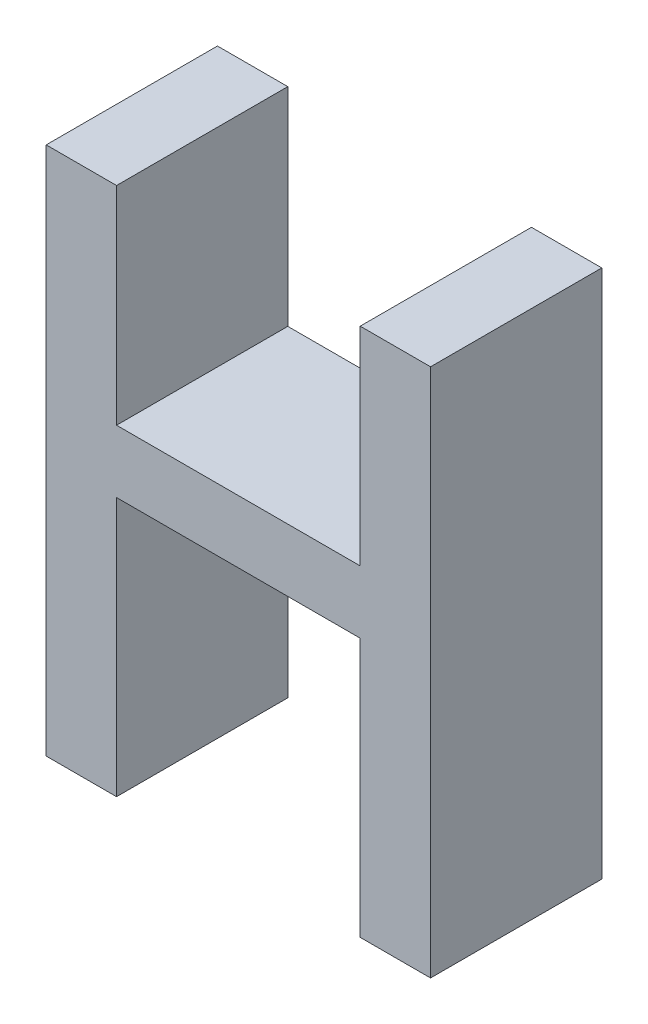
ISO-10303-21;
HEADER;
FILE_DESCRIPTION(('STEP AP214'),'2;1');
FILE_NAME('part.step','',(''),(''),'','','');
FILE_SCHEMA(('AUTOMOTIVE_DESIGN { 1 0 10303 214 1 1 1 1 }'));
ENDSEC;
DATA;
#1=APPLICATION_CONTEXT('core data for automotive mechanical design processes');
#2=APPLICATION_PROTOCOL_DEFINITION('international standard','automotive_design',2000,#1);
#3=PRODUCT_CONTEXT('',#1,'mechanical');
#4=PRODUCT('Part','Part','',(#3));
#5=PRODUCT_RELATED_PRODUCT_CATEGORY('part','',(#4));
#6=PRODUCT_DEFINITION_FORMATION('','',#4);
#7=PRODUCT_DEFINITION_CONTEXT('part definition',#1,'design');
#8=PRODUCT_DEFINITION('design','',#6,#7);
#9=PRODUCT_DEFINITION_SHAPE('','',#8);
#10=(LENGTH_UNIT() NAMED_UNIT(*) SI_UNIT(.MILLI.,.METRE.));
#11=(NAMED_UNIT(*) PLANE_ANGLE_UNIT() SI_UNIT($,.RADIAN.));
#12=(NAMED_UNIT(*) SI_UNIT($,.STERADIAN.) SOLID_ANGLE_UNIT());
#13=UNCERTAINTY_MEASURE_WITH_UNIT(LENGTH_MEASURE(1.E-05),#10,'distance_accuracy_value','');
#14=(GEOMETRIC_REPRESENTATION_CONTEXT(3) GLOBAL_UNCERTAINTY_ASSIGNED_CONTEXT((#13)) GLOBAL_UNIT_ASSIGNED_CONTEXT((#10,
#11,#12)) REPRESENTATION_CONTEXT('',''));
#15=CARTESIAN_POINT('',(0.,0.,0.));
#16=DIRECTION('',(0.,0.,1.));
#17=DIRECTION('',(1.,0.,0.));
#18=AXIS2_PLACEMENT_3D('',#15,#16,#17);
#19=CARTESIAN_POINT('',(-0.424212791142524,-2.790411377833,0.));
#20=DIRECTION('',(-1.,0.,0.));
#21=DIRECTION('',(0.,-1.,0.));
#22=AXIS2_PLACEMENT_3D('',#19,#20,#21);
#23=PLANE('',#22);
#24=DIRECTION('',(0.,1.,0.));
#25=VECTOR('',#24,1.);
#26=CARTESIAN_POINT('',(-0.424212791142524,-2.941706644287,0.));
#27=LINE('',#26,#25);
#28=CARTESIAN_POINT('',(-0.424212791142524,-2.941706644287,0.));
#29=VERTEX_POINT('',#28);
#30=CARTESIAN_POINT('',(-0.424212791142524,-2.790411377833,0.));
#31=VERTEX_POINT('',#30);
#32=EDGE_CURVE('E11',#29,#31,#27,.T.);
#33=ORIENTED_EDGE('',*,*,#32,.F.);
#34=DIRECTION('',(0.,0.,1.));
#35=VECTOR('',#34,1.);
#36=CARTESIAN_POINT('',(-0.424212791142524,-2.941706644287,0.));
#37=LINE('',#36,#35);
#38=CARTESIAN_POINT('',(-0.424212791142524,-2.941706644287,0.1));
#39=VERTEX_POINT('',#38);
#40=EDGE_CURVE('E24',#29,#39,#37,.T.);
#41=ORIENTED_EDGE('',*,*,#40,.T.);
#42=DIRECTION('',(0.,-1.,0.));
#43=VECTOR('',#42,1.);
#44=CARTESIAN_POINT('',(-0.424212791142524,-2.941706644287,0.1));
#45=LINE('',#44,#43);
#46=CARTESIAN_POINT('',(-0.424212791142524,-2.790411377833,0.1));
#47=VERTEX_POINT('',#46);
#48=EDGE_CURVE('E124',#47,#39,#45,.T.);
#49=ORIENTED_EDGE('',*,*,#48,.F.);
#50=DIRECTION('',(0.,0.,1.));
#51=VECTOR('',#50,1.);
#52=CARTESIAN_POINT('',(-0.424212791142524,-2.790411377833,0.));
#53=LINE('',#52,#51);
#54=EDGE_CURVE('E197',#31,#47,#53,.T.);
#55=ORIENTED_EDGE('',*,*,#54,.F.);
#56=EDGE_LOOP('',(#33,#41,#49,#55));
#57=FACE_BOUND('',#56,.T.);
#58=ADVANCED_FACE('F17',(#57),#23,.T.);
#59=CARTESIAN_POINT('',(-0.566490458933513,-2.790411377833,0.));
#60=DIRECTION('',(0.,-1.,0.));
#61=DIRECTION('',(1.,0.,0.));
#62=AXIS2_PLACEMENT_3D('',#59,#60,#61);
#63=PLANE('',#62);
#64=DIRECTION('',(-1.,0.,0.));
#65=VECTOR('',#64,1.);
#66=CARTESIAN_POINT('',(-0.424212791142524,-2.790411377833,0.));
#67=LINE('',#66,#65);
#68=CARTESIAN_POINT('',(-0.566490458933513,-2.790411377833,0.));
#69=VERTEX_POINT('',#68);
#70=EDGE_CURVE('E195',#31,#69,#67,.T.);
#71=ORIENTED_EDGE('',*,*,#70,.F.);
#72=ORIENTED_EDGE('',*,*,#54,.T.);
#73=DIRECTION('',(1.,0.,0.));
#74=VECTOR('',#73,1.);
#75=CARTESIAN_POINT('',(-0.424212791142524,-2.790411377833,0.1));
#76=LINE('',#75,#74);
#77=CARTESIAN_POINT('',(-0.566490458933513,-2.790411377833,0.1));
#78=VERTEX_POINT('',#77);
#79=EDGE_CURVE('E193',#78,#47,#76,.T.);
#80=ORIENTED_EDGE('',*,*,#79,.F.);
#81=DIRECTION('',(0.,0.,1.));
#82=VECTOR('',#81,1.);
#83=CARTESIAN_POINT('',(-0.566490458933513,-2.790411377833,0.));
#84=LINE('',#83,#82);
#85=EDGE_CURVE('E190',#69,#78,#84,.T.);
#86=ORIENTED_EDGE('',*,*,#85,.F.);
#87=EDGE_LOOP('',(#71,#72,#80,#86));
#88=FACE_BOUND('',#87,.T.);
#89=ADVANCED_FACE('F235',(#88),#63,.T.);
#90=CARTESIAN_POINT('',(-0.566490458933513,-2.941706644287,0.));
#91=DIRECTION('',(1.,0.,0.));
#92=DIRECTION('',(0.,1.,0.));
#93=AXIS2_PLACEMENT_3D('',#90,#91,#92);
#94=PLANE('',#93);
#95=DIRECTION('',(0.,-1.,0.));
#96=VECTOR('',#95,1.);
#97=CARTESIAN_POINT('',(-0.566490458933513,-2.790411377833,0.));
#98=LINE('',#97,#96);
#99=CARTESIAN_POINT('',(-0.566490458933513,-2.941706644287,0.));
#100=VERTEX_POINT('',#99);
#101=EDGE_CURVE('E188',#69,#100,#98,.T.);
#102=ORIENTED_EDGE('',*,*,#101,.F.);
#103=ORIENTED_EDGE('',*,*,#85,.T.);
#104=DIRECTION('',(0.,1.,0.));
#105=VECTOR('',#104,1.);
#106=CARTESIAN_POINT('',(-0.566490458933513,-2.790411377833,0.1));
#107=LINE('',#106,#105);
#108=CARTESIAN_POINT('',(-0.566490458933513,-2.941706644287,0.1));
#109=VERTEX_POINT('',#108);
#110=EDGE_CURVE('E185',#109,#78,#107,.T.);
#111=ORIENTED_EDGE('',*,*,#110,.F.);
#112=DIRECTION('',(0.,0.,1.));
#113=VECTOR('',#112,1.);
#114=CARTESIAN_POINT('',(-0.566490458933513,-2.941706644287,0.));
#115=LINE('',#114,#113);
#116=EDGE_CURVE('E182',#100,#109,#115,.T.);
#117=ORIENTED_EDGE('',*,*,#116,.F.);
#118=EDGE_LOOP('',(#102,#103,#111,#117));
#119=FACE_BOUND('',#118,.T.);
#120=ADVANCED_FACE('F231',(#119),#94,.T.);
#121=CARTESIAN_POINT('',(-0.607570630619644,-2.941706644287,0.));
#122=DIRECTION('',(0.,-1.,0.));
#123=DIRECTION('',(1.,0.,0.));
#124=AXIS2_PLACEMENT_3D('',#121,#122,#123);
#125=PLANE('',#124);
#126=DIRECTION('',(-1.,0.,0.));
#127=VECTOR('',#126,1.);
#128=CARTESIAN_POINT('',(-0.566490458933513,-2.941706644287,0.));
#129=LINE('',#128,#127);
#130=CARTESIAN_POINT('',(-0.607570630619644,-2.941706644287,0.));
#131=VERTEX_POINT('',#130);
#132=EDGE_CURVE('E180',#100,#131,#129,.T.);
#133=ORIENTED_EDGE('',*,*,#132,.F.);
#134=ORIENTED_EDGE('',*,*,#116,.T.);
#135=DIRECTION('',(1.,0.,0.));
#136=VECTOR('',#135,1.);
#137=CARTESIAN_POINT('',(-0.566490458933513,-2.941706644287,0.1));
#138=LINE('',#137,#136);
#139=CARTESIAN_POINT('',(-0.607570630619644,-2.941706644287,0.1));
#140=VERTEX_POINT('',#139);
#141=EDGE_CURVE('E177',#140,#109,#138,.T.);
#142=ORIENTED_EDGE('',*,*,#141,.F.);
#143=DIRECTION('',(0.,0.,1.));
#144=VECTOR('',#143,1.);
#145=CARTESIAN_POINT('',(-0.607570630619644,-2.941706644287,0.));
#146=LINE('',#145,#144);
#147=EDGE_CURVE('E174',#131,#140,#146,.T.);
#148=ORIENTED_EDGE('',*,*,#147,.F.);
#149=EDGE_LOOP('',(#133,#134,#142,#148));
#150=FACE_BOUND('',#149,.T.);
#151=ADVANCED_FACE('F227',(#150),#125,.T.);
#152=CARTESIAN_POINT('',(-0.607570630619644,-2.632603401234,0.));
#153=DIRECTION('',(-1.,0.,0.));
#154=DIRECTION('',(0.,-1.,0.));
#155=AXIS2_PLACEMENT_3D('',#152,#153,#154);
#156=PLANE('',#155);
#157=DIRECTION('',(0.,1.,0.));
#158=VECTOR('',#157,1.);
#159=CARTESIAN_POINT('',(-0.607570630619644,-2.941706644287,0.));
#160=LINE('',#159,#158);
#161=CARTESIAN_POINT('',(-0.607570630619644,-2.632603401234,0.));
#162=VERTEX_POINT('',#161);
#163=EDGE_CURVE('E172',#131,#162,#160,.T.);
#164=ORIENTED_EDGE('',*,*,#163,.F.);
#165=ORIENTED_EDGE('',*,*,#147,.T.);
#166=DIRECTION('',(0.,-1.,0.));
#167=VECTOR('',#166,1.);
#168=CARTESIAN_POINT('',(-0.607570630619644,-2.941706644287,0.1));
#169=LINE('',#168,#167);
#170=CARTESIAN_POINT('',(-0.607570630619644,-2.632603401234,0.1));
#171=VERTEX_POINT('',#170);
#172=EDGE_CURVE('E169',#171,#140,#169,.T.);
#173=ORIENTED_EDGE('',*,*,#172,.F.);
#174=DIRECTION('',(0.,0.,1.));
#175=VECTOR('',#174,1.);
#176=CARTESIAN_POINT('',(-0.607570630619644,-2.632603401234,0.));
#177=LINE('',#176,#175);
#178=EDGE_CURVE('E166',#162,#171,#177,.T.);
#179=ORIENTED_EDGE('',*,*,#178,.F.);
#180=EDGE_LOOP('',(#164,#165,#173,#179));
#181=FACE_BOUND('',#180,.T.);
#182=ADVANCED_FACE('F223',(#181),#156,.T.);
#183=CARTESIAN_POINT('',(-0.566490458933513,-2.632603401234,0.));
#184=DIRECTION('',(0.,1.,0.));
#185=DIRECTION('',(-1.,0.,0.));
#186=AXIS2_PLACEMENT_3D('',#183,#184,#185);
#187=PLANE('',#186);
#188=DIRECTION('',(1.,0.,0.));
#189=VECTOR('',#188,1.);
#190=CARTESIAN_POINT('',(-0.607570630619644,-2.632603401234,0.));
#191=LINE('',#190,#189);
#192=CARTESIAN_POINT('',(-0.566490458933513,-2.632603401234,0.));
#193=VERTEX_POINT('',#192);
#194=EDGE_CURVE('E164',#162,#193,#191,.T.);
#195=ORIENTED_EDGE('',*,*,#194,.F.);
#196=ORIENTED_EDGE('',*,*,#178,.T.);
#197=DIRECTION('',(-1.,0.,0.));
#198=VECTOR('',#197,1.);
#199=CARTESIAN_POINT('',(-0.607570630619644,-2.632603401234,0.1));
#200=LINE('',#199,#198);
#201=CARTESIAN_POINT('',(-0.566490458933513,-2.632603401234,0.1));
#202=VERTEX_POINT('',#201);
#203=EDGE_CURVE('E161',#202,#171,#200,.T.);
#204=ORIENTED_EDGE('',*,*,#203,.F.);
#205=DIRECTION('',(0.,0.,1.));
#206=VECTOR('',#205,1.);
#207=CARTESIAN_POINT('',(-0.566490458933513,-2.632603401234,0.));
#208=LINE('',#207,#206);
#209=EDGE_CURVE('E158',#193,#202,#208,.T.);
#210=ORIENTED_EDGE('',*,*,#209,.F.);
#211=EDGE_LOOP('',(#195,#196,#204,#210));
#212=FACE_BOUND('',#211,.T.);
#213=ADVANCED_FACE('F219',(#212),#187,.T.);
#214=CARTESIAN_POINT('',(-0.566490458933513,-2.753840005479,0.));
#215=DIRECTION('',(1.,0.,0.));
#216=DIRECTION('',(0.,1.,0.));
#217=AXIS2_PLACEMENT_3D('',#214,#215,#216);
#218=PLANE('',#217);
#219=DIRECTION('',(0.,-1.,0.));
#220=VECTOR('',#219,1.);
#221=CARTESIAN_POINT('',(-0.566490458933513,-2.632603401234,0.));
#222=LINE('',#221,#220);
#223=CARTESIAN_POINT('',(-0.566490458933513,-2.753840005479,0.));
#224=VERTEX_POINT('',#223);
#225=EDGE_CURVE('E156',#193,#224,#222,.T.);
#226=ORIENTED_EDGE('',*,*,#225,.F.);
#227=ORIENTED_EDGE('',*,*,#209,.T.);
#228=DIRECTION('',(0.,1.,0.));
#229=VECTOR('',#228,1.);
#230=CARTESIAN_POINT('',(-0.566490458933513,-2.632603401234,0.1));
#231=LINE('',#230,#229);
#232=CARTESIAN_POINT('',(-0.566490458933513,-2.753840005479,0.1));
#233=VERTEX_POINT('',#232);
#234=EDGE_CURVE('E153',#233,#202,#231,.T.);
#235=ORIENTED_EDGE('',*,*,#234,.F.);
#236=DIRECTION('',(0.,0.,1.));
#237=VECTOR('',#236,1.);
#238=CARTESIAN_POINT('',(-0.566490458933513,-2.753840005479,0.));
#239=LINE('',#238,#237);
#240=EDGE_CURVE('E150',#224,#233,#239,.T.);
#241=ORIENTED_EDGE('',*,*,#240,.F.);
#242=EDGE_LOOP('',(#226,#227,#235,#241));
#243=FACE_BOUND('',#242,.T.);
#244=ADVANCED_FACE('F215',(#243),#218,.T.);
#245=CARTESIAN_POINT('',(-0.424212791142524,-2.753840005479,0.));
#246=DIRECTION('',(0.,1.,0.));
#247=DIRECTION('',(-1.,0.,0.));
#248=AXIS2_PLACEMENT_3D('',#245,#246,#247);
#249=PLANE('',#248);
#250=DIRECTION('',(1.,0.,0.));
#251=VECTOR('',#250,1.);
#252=CARTESIAN_POINT('',(-0.566490458933513,-2.753840005479,0.));
#253=LINE('',#252,#251);
#254=CARTESIAN_POINT('',(-0.424212791142524,-2.753840005479,0.));
#255=VERTEX_POINT('',#254);
#256=EDGE_CURVE('E148',#224,#255,#253,.T.);
#257=ORIENTED_EDGE('',*,*,#256,.F.);
#258=ORIENTED_EDGE('',*,*,#240,.T.);
#259=DIRECTION('',(-1.,0.,0.));
#260=VECTOR('',#259,1.);
#261=CARTESIAN_POINT('',(-0.566490458933513,-2.753840005479,0.1));
#262=LINE('',#261,#260);
#263=CARTESIAN_POINT('',(-0.424212791142524,-2.753840005479,0.1));
#264=VERTEX_POINT('',#263);
#265=EDGE_CURVE('E145',#264,#233,#262,.T.);
#266=ORIENTED_EDGE('',*,*,#265,.F.);
#267=DIRECTION('',(0.,0.,1.));
#268=VECTOR('',#267,1.);
#269=CARTESIAN_POINT('',(-0.424212791142524,-2.753840005479,0.));
#270=LINE('',#269,#268);
#271=EDGE_CURVE('E142',#255,#264,#270,.T.);
#272=ORIENTED_EDGE('',*,*,#271,.F.);
#273=EDGE_LOOP('',(#257,#258,#266,#272));
#274=FACE_BOUND('',#273,.T.);
#275=ADVANCED_FACE('F211',(#274),#249,.T.);
#276=CARTESIAN_POINT('',(-0.424212791142524,-2.632603401234,0.));
#277=DIRECTION('',(-1.,0.,0.));
#278=DIRECTION('',(0.,-1.,0.));
#279=AXIS2_PLACEMENT_3D('',#276,#277,#278);
#280=PLANE('',#279);
#281=DIRECTION('',(0.,1.,0.));
#282=VECTOR('',#281,1.);
#283=CARTESIAN_POINT('',(-0.424212791142524,-2.753840005479,0.));
#284=LINE('',#283,#282);
#285=CARTESIAN_POINT('',(-0.424212791142524,-2.632603401234,0.));
#286=VERTEX_POINT('',#285);
#287=EDGE_CURVE('E140',#255,#286,#284,.T.);
#288=ORIENTED_EDGE('',*,*,#287,.F.);
#289=ORIENTED_EDGE('',*,*,#271,.T.);
#290=DIRECTION('',(0.,-1.,0.));
#291=VECTOR('',#290,1.);
#292=CARTESIAN_POINT('',(-0.424212791142524,-2.753840005479,0.1));
#293=LINE('',#292,#291);
#294=CARTESIAN_POINT('',(-0.424212791142524,-2.632603401234,0.1));
#295=VERTEX_POINT('',#294);
#296=EDGE_CURVE('E137',#295,#264,#293,.T.);
#297=ORIENTED_EDGE('',*,*,#296,.F.);
#298=DIRECTION('',(0.,0.,1.));
#299=VECTOR('',#298,1.);
#300=CARTESIAN_POINT('',(-0.424212791142524,-2.632603401234,0.));
#301=LINE('',#300,#299);
#302=EDGE_CURVE('E134',#286,#295,#301,.T.);
#303=ORIENTED_EDGE('',*,*,#302,.F.);
#304=EDGE_LOOP('',(#288,#289,#297,#303));
#305=FACE_BOUND('',#304,.T.);
#306=ADVANCED_FACE('F207',(#305),#280,.T.);
#307=CARTESIAN_POINT('',(-0.383132619456393,-2.632603401234,0.));
#308=DIRECTION('',(0.,1.,0.));
#309=DIRECTION('',(-1.,0.,0.));
#310=AXIS2_PLACEMENT_3D('',#307,#308,#309);
#311=PLANE('',#310);
#312=DIRECTION('',(1.,0.,0.));
#313=VECTOR('',#312,1.);
#314=CARTESIAN_POINT('',(-0.424212791142524,-2.632603401234,0.));
#315=LINE('',#314,#313);
#316=CARTESIAN_POINT('',(-0.383132619456393,-2.632603401234,0.));
#317=VERTEX_POINT('',#316);
#318=EDGE_CURVE('E132',#286,#317,#315,.T.);
#319=ORIENTED_EDGE('',*,*,#318,.F.);
#320=ORIENTED_EDGE('',*,*,#302,.T.);
#321=DIRECTION('',(-1.,0.,0.));
#322=VECTOR('',#321,1.);
#323=CARTESIAN_POINT('',(-0.424212791142524,-2.632603401234,0.1));
#324=LINE('',#323,#322);
#325=CARTESIAN_POINT('',(-0.383132619456393,-2.632603401234,0.1));
#326=VERTEX_POINT('',#325);
#327=EDGE_CURVE('E130',#326,#295,#324,.T.);
#328=ORIENTED_EDGE('',*,*,#327,.F.);
#329=DIRECTION('',(0.,0.,1.));
#330=VECTOR('',#329,1.);
#331=CARTESIAN_POINT('',(-0.383132619456393,-2.632603401234,0.));
#332=LINE('',#331,#330);
#333=EDGE_CURVE('E109',#317,#326,#332,.T.);
#334=ORIENTED_EDGE('',*,*,#333,.F.);
#335=EDGE_LOOP('',(#319,#320,#328,#334));
#336=FACE_BOUND('',#335,.T.);
#337=ADVANCED_FACE('F205',(#336),#311,.T.);
#338=CARTESIAN_POINT('',(-0.383132619456393,-2.941706644287,0.));
#339=DIRECTION('',(1.,0.,0.));
#340=DIRECTION('',(0.,1.,0.));
#341=AXIS2_PLACEMENT_3D('',#338,#339,#340);
#342=PLANE('',#341);
#343=DIRECTION('',(0.,-1.,0.));
#344=VECTOR('',#343,1.);
#345=CARTESIAN_POINT('',(-0.383132619456393,-2.632603401234,0.));
#346=LINE('',#345,#344);
#347=CARTESIAN_POINT('',(-0.383132619456393,-2.941706644287,0.));
#348=VERTEX_POINT('',#347);
#349=EDGE_CURVE('E113',#317,#348,#346,.T.);
#350=ORIENTED_EDGE('',*,*,#349,.F.);
#351=ORIENTED_EDGE('',*,*,#333,.T.);
#352=DIRECTION('',(0.,1.,0.));
#353=VECTOR('',#352,1.);
#354=CARTESIAN_POINT('',(-0.383132619456393,-2.632603401234,0.1));
#355=LINE('',#354,#353);
#356=CARTESIAN_POINT('',(-0.383132619456393,-2.941706644287,0.1));
#357=VERTEX_POINT('',#356);
#358=EDGE_CURVE('E102',#357,#326,#355,.T.);
#359=ORIENTED_EDGE('',*,*,#358,.F.);
#360=DIRECTION('',(0.,0.,1.));
#361=VECTOR('',#360,1.);
#362=CARTESIAN_POINT('',(-0.383132619456393,-2.941706644287,0.));
#363=LINE('',#362,#361);
#364=EDGE_CURVE('E106',#348,#357,#363,.T.);
#365=ORIENTED_EDGE('',*,*,#364,.F.);
#366=EDGE_LOOP('',(#350,#351,#359,#365));
#367=FACE_BOUND('',#366,.T.);
#368=ADVANCED_FACE('F105',(#367),#342,.T.);
#369=CARTESIAN_POINT('',(-0.424212791142524,-2.941706644287,0.));
#370=DIRECTION('',(0.,-1.,0.));
#371=DIRECTION('',(1.,0.,0.));
#372=AXIS2_PLACEMENT_3D('',#369,#370,#371);
#373=PLANE('',#372);
#374=DIRECTION('',(-1.,0.,0.));
#375=VECTOR('',#374,1.);
#376=CARTESIAN_POINT('',(-0.383132619456393,-2.941706644287,0.));
#377=LINE('',#376,#375);
#378=EDGE_CURVE('E119',#348,#29,#377,.T.);
#379=ORIENTED_EDGE('',*,*,#378,.F.);
#380=ORIENTED_EDGE('',*,*,#364,.T.);
#381=DIRECTION('',(1.,0.,0.));
#382=VECTOR('',#381,1.);
#383=CARTESIAN_POINT('',(-0.383132619456393,-2.941706644287,0.1));
#384=LINE('',#383,#382);
#385=EDGE_CURVE('E118',#39,#357,#384,.T.);
#386=ORIENTED_EDGE('',*,*,#385,.F.);
#387=ORIENTED_EDGE('',*,*,#40,.F.);
#388=EDGE_LOOP('',(#379,#380,#386,#387));
#389=FACE_BOUND('',#388,.T.);
#390=ADVANCED_FACE('F117',(#389),#373,.T.);
#391=CARTESIAN_POINT('',(-0.495351625038019,-2.785184116071,0.));
#392=DIRECTION('',(0.,0.,1.));
#393=DIRECTION('',(1.,0.,0.));
#394=AXIS2_PLACEMENT_3D('',#391,#392,#393);
#395=PLANE('',#394);
#396=ORIENTED_EDGE('',*,*,#378,.T.);
#397=ORIENTED_EDGE('',*,*,#32,.T.);
#398=ORIENTED_EDGE('',*,*,#70,.T.);
#399=ORIENTED_EDGE('',*,*,#101,.T.);
#400=ORIENTED_EDGE('',*,*,#132,.T.);
#401=ORIENTED_EDGE('',*,*,#163,.T.);
#402=ORIENTED_EDGE('',*,*,#194,.T.);
#403=ORIENTED_EDGE('',*,*,#225,.T.);
#404=ORIENTED_EDGE('',*,*,#256,.T.);
#405=ORIENTED_EDGE('',*,*,#287,.T.);
#406=ORIENTED_EDGE('',*,*,#318,.T.);
#407=ORIENTED_EDGE('',*,*,#349,.T.);
#408=EDGE_LOOP('',(#396,#397,#398,#399,#400,#401,#402,#403,#404,#405,#406,#407));
#409=FACE_BOUND('',#408,.T.);
#410=ADVANCED_FACE('F200',(#409),#395,.F.);
#411=CARTESIAN_POINT('',(-0.495351625038019,-2.785184116071,0.1));
#412=DIRECTION('',(0.,0.,1.));
#413=DIRECTION('',(1.,0.,0.));
#414=AXIS2_PLACEMENT_3D('',#411,#412,#413);
#415=PLANE('',#414);
#416=ORIENTED_EDGE('',*,*,#385,.T.);
#417=ORIENTED_EDGE('',*,*,#358,.T.);
#418=ORIENTED_EDGE('',*,*,#327,.T.);
#419=ORIENTED_EDGE('',*,*,#296,.T.);
#420=ORIENTED_EDGE('',*,*,#265,.T.);
#421=ORIENTED_EDGE('',*,*,#234,.T.);
#422=ORIENTED_EDGE('',*,*,#203,.T.);
#423=ORIENTED_EDGE('',*,*,#172,.T.);
#424=ORIENTED_EDGE('',*,*,#141,.T.);
#425=ORIENTED_EDGE('',*,*,#110,.T.);
#426=ORIENTED_EDGE('',*,*,#79,.T.);
#427=ORIENTED_EDGE('',*,*,#48,.T.);
#428=EDGE_LOOP('',(#416,#417,#418,#419,#420,#421,#422,#423,#424,#425,#426,#427));
#429=FACE_BOUND('',#428,.T.);
#430=ADVANCED_FACE('F122',(#429),#415,.T.);
#431=CLOSED_SHELL('',(#58,#89,#120,#151,#182,#213,#244,#275,#306,#337,#368,#390,#410,#430));
#432=MANIFOLD_SOLID_BREP('B1',#431);
#433=ADVANCED_BREP_SHAPE_REPRESENTATION('',(#18,#432),#14);
#434=SHAPE_DEFINITION_REPRESENTATION(#9,#433);
ENDSEC;
END-ISO-10303-21;
